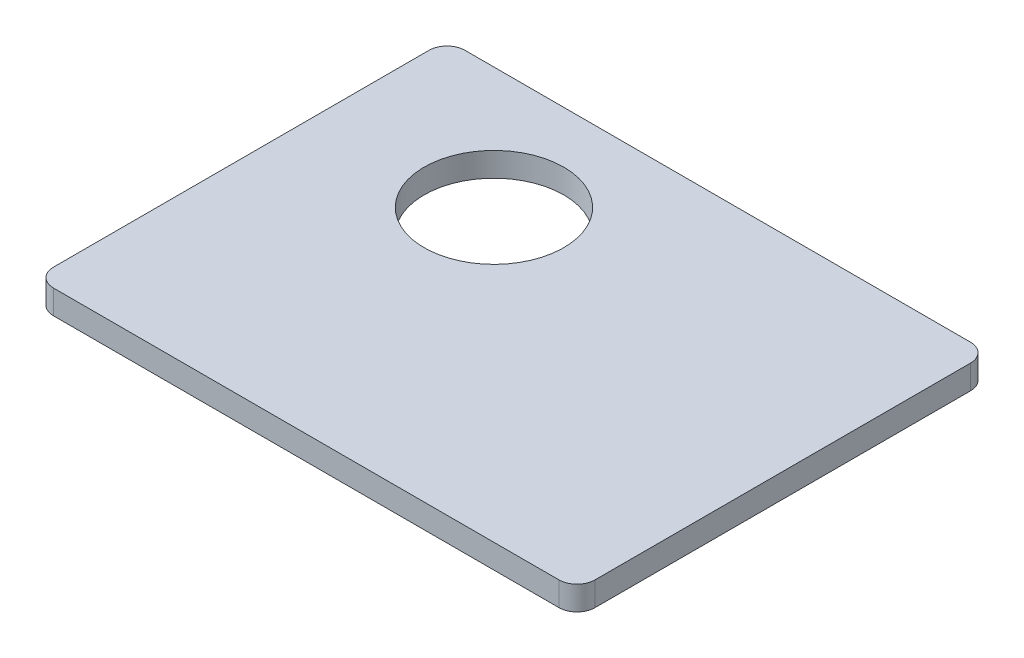
ISO-10303-21;
HEADER;
FILE_DESCRIPTION(('STEP AP214'),'2;1');
FILE_NAME('part.step','',(''),(''),'','','');
FILE_SCHEMA(('AUTOMOTIVE_DESIGN { 1 0 10303 214 1 1 1 1 }'));
ENDSEC;
DATA;
#1=APPLICATION_CONTEXT('core data for automotive mechanical design processes');
#2=APPLICATION_PROTOCOL_DEFINITION('international standard','automotive_design',2000,#1);
#3=PRODUCT_CONTEXT('',#1,'mechanical');
#4=PRODUCT('Part','Part','',(#3));
#5=PRODUCT_RELATED_PRODUCT_CATEGORY('part','',(#4));
#6=PRODUCT_DEFINITION_FORMATION('','',#4);
#7=PRODUCT_DEFINITION_CONTEXT('part definition',#1,'design');
#8=PRODUCT_DEFINITION('design','',#6,#7);
#9=PRODUCT_DEFINITION_SHAPE('','',#8);
#10=(LENGTH_UNIT() NAMED_UNIT(*) SI_UNIT(.MILLI.,.METRE.));
#11=(NAMED_UNIT(*) PLANE_ANGLE_UNIT() SI_UNIT($,.RADIAN.));
#12=(NAMED_UNIT(*) SI_UNIT($,.STERADIAN.) SOLID_ANGLE_UNIT());
#13=UNCERTAINTY_MEASURE_WITH_UNIT(LENGTH_MEASURE(1.E-05),#10,'distance_accuracy_value','');
#14=(GEOMETRIC_REPRESENTATION_CONTEXT(3) GLOBAL_UNCERTAINTY_ASSIGNED_CONTEXT((#13)) GLOBAL_UNIT_ASSIGNED_CONTEXT((#10,
#11,#12)) REPRESENTATION_CONTEXT('',''));
#15=CARTESIAN_POINT('',(0.,0.,0.));
#16=DIRECTION('',(0.,0.,1.));
#17=DIRECTION('',(1.,0.,0.));
#18=AXIS2_PLACEMENT_3D('',#15,#16,#17);
#19=CARTESIAN_POINT('',(0.,1.,7.15787898398317));
#20=DIRECTION('',(0.,0.,-1.));
#21=DIRECTION('',(-1.,0.,0.));
#22=AXIS2_PLACEMENT_3D('',#19,#20,#21);
#23=PLANE('',#22);
#24=DIRECTION('',(1.,0.,0.));
#25=VECTOR('',#24,1.);
#26=CARTESIAN_POINT('',(0.,0.,7.15787898398317));
#27=LINE('',#26,#25);
#28=CARTESIAN_POINT('',(-10.7596343633716,0.,7.15787898398317));
#29=VERTEX_POINT('',#28);
#30=CARTESIAN_POINT('',(10.2403656366284,0.,7.15787898398317));
#31=VERTEX_POINT('',#30);
#32=EDGE_CURVE('E131',#29,#31,#27,.T.);
#33=ORIENTED_EDGE('',*,*,#32,.F.);
#34=DIRECTION('',(0.,-1.,0.));
#35=VECTOR('',#34,1.);
#36=CARTESIAN_POINT('',(-10.7596343633716,1.,7.15787898398317));
#37=LINE('',#36,#35);
#38=CARTESIAN_POINT('',(-10.7596343633716,1.,7.15787898398317));
#39=VERTEX_POINT('',#38);
#40=EDGE_CURVE('E11',#39,#29,#37,.T.);
#41=ORIENTED_EDGE('',*,*,#40,.F.);
#42=DIRECTION('',(1.,0.,0.));
#43=VECTOR('',#42,1.);
#44=CARTESIAN_POINT('',(0.,1.,7.15787898398317));
#45=LINE('',#44,#43);
#46=CARTESIAN_POINT('',(10.2403656366284,1.,7.15787898398317));
#47=VERTEX_POINT('',#46);
#48=EDGE_CURVE('E148',#39,#47,#45,.T.);
#49=ORIENTED_EDGE('',*,*,#48,.T.);
#50=DIRECTION('',(0.,-1.,0.));
#51=VECTOR('',#50,1.);
#52=CARTESIAN_POINT('',(10.2403656366284,1.,7.15787898398317));
#53=LINE('',#52,#51);
#54=EDGE_CURVE('E53',#47,#31,#53,.T.);
#55=ORIENTED_EDGE('',*,*,#54,.T.);
#56=EDGE_LOOP('',(#33,#41,#49,#55));
#57=FACE_BOUND('',#56,.T.);
#58=ADVANCED_FACE('F37',(#57),#23,.T.);
#59=CARTESIAN_POINT('',(-10.7596343633716,1.,7.90787898398317));
#60=DIRECTION('',(0.,-1.,0.));
#61=DIRECTION('',(0.,0.,-1.));
#62=AXIS2_PLACEMENT_3D('',#59,#60,#61);
#63=CYLINDRICAL_SURFACE('',#62,0.750000000000001);
#64=CARTESIAN_POINT('',(-10.7596343633716,0.,7.90787898398317));
#65=DIRECTION('',(0.,1.,0.));
#66=DIRECTION('',(0.,0.,1.));
#67=AXIS2_PLACEMENT_3D('',#64,#65,#66);
#68=CIRCLE('',#67,0.750000000000001);
#69=CARTESIAN_POINT('',(-11.5096343633716,0.,7.90787898398318));
#70=VERTEX_POINT('',#69);
#71=EDGE_CURVE('E133',#29,#70,#68,.T.);
#72=ORIENTED_EDGE('',*,*,#71,.T.);
#73=DIRECTION('',(0.,-1.,0.));
#74=VECTOR('',#73,1.);
#75=CARTESIAN_POINT('',(-11.5096343633716,1.,7.90787898398318));
#76=LINE('',#75,#74);
#77=CARTESIAN_POINT('',(-11.5096343633716,1.,7.90787898398318));
#78=VERTEX_POINT('',#77);
#79=EDGE_CURVE('E45',#78,#70,#76,.T.);
#80=ORIENTED_EDGE('',*,*,#79,.F.);
#81=CARTESIAN_POINT('',(-10.7596343633716,1.,7.90787898398317));
#82=DIRECTION('',(0.,1.,0.));
#83=DIRECTION('',(0.,0.,1.));
#84=AXIS2_PLACEMENT_3D('',#81,#82,#83);
#85=CIRCLE('',#84,0.750000000000001);
#86=EDGE_CURVE('E181',#39,#78,#85,.T.);
#87=ORIENTED_EDGE('',*,*,#86,.F.);
#88=ORIENTED_EDGE('',*,*,#40,.T.);
#89=EDGE_LOOP('',(#72,#80,#87,#88));
#90=FACE_BOUND('',#89,.T.);
#91=ADVANCED_FACE('F207',(#90),#63,.T.);
#92=CARTESIAN_POINT('',(-11.5096343633716,1.,0.));
#93=DIRECTION('',(1.,0.,0.));
#94=DIRECTION('',(0.,0.,-1.));
#95=AXIS2_PLACEMENT_3D('',#92,#93,#94);
#96=PLANE('',#95);
#97=DIRECTION('',(0.,0.,1.));
#98=VECTOR('',#97,1.);
#99=CARTESIAN_POINT('',(-11.5096343633716,0.,0.));
#100=LINE('',#99,#98);
#101=CARTESIAN_POINT('',(-11.5096343633716,0.,23.5078789839832));
#102=VERTEX_POINT('',#101);
#103=EDGE_CURVE('E136',#70,#102,#100,.T.);
#104=ORIENTED_EDGE('',*,*,#103,.T.);
#105=DIRECTION('',(0.,-1.,0.));
#106=VECTOR('',#105,1.);
#107=CARTESIAN_POINT('',(-11.5096343633716,1.,23.5078789839832));
#108=LINE('',#107,#106);
#109=CARTESIAN_POINT('',(-11.5096343633716,1.,23.5078789839832));
#110=VERTEX_POINT('',#109);
#111=EDGE_CURVE('E155',#110,#102,#108,.T.);
#112=ORIENTED_EDGE('',*,*,#111,.F.);
#113=DIRECTION('',(0.,0.,1.));
#114=VECTOR('',#113,1.);
#115=CARTESIAN_POINT('',(-11.5096343633716,1.,0.));
#116=LINE('',#115,#114);
#117=EDGE_CURVE('E164',#78,#110,#116,.T.);
#118=ORIENTED_EDGE('',*,*,#117,.F.);
#119=ORIENTED_EDGE('',*,*,#79,.T.);
#120=EDGE_LOOP('',(#104,#112,#118,#119));
#121=FACE_BOUND('',#120,.T.);
#122=ADVANCED_FACE('F162',(#121),#96,.F.);
#123=CARTESIAN_POINT('',(-10.7596343633716,1.,23.5078789839832));
#124=DIRECTION('',(0.,-1.,0.));
#125=DIRECTION('',(0.,0.,-1.));
#126=AXIS2_PLACEMENT_3D('',#123,#124,#125);
#127=CYLINDRICAL_SURFACE('',#126,0.750000000000001);
#128=CARTESIAN_POINT('',(-10.7596343633716,0.,23.5078789839832));
#129=DIRECTION('',(0.,1.,0.));
#130=DIRECTION('',(0.,0.,1.));
#131=AXIS2_PLACEMENT_3D('',#128,#129,#130);
#132=CIRCLE('',#131,0.750000000000001);
#133=CARTESIAN_POINT('',(-10.7596343633716,0.,24.2578789839832));
#134=VERTEX_POINT('',#133);
#135=EDGE_CURVE('E138',#102,#134,#132,.T.);
#136=ORIENTED_EDGE('',*,*,#135,.T.);
#137=DIRECTION('',(0.,-1.,0.));
#138=VECTOR('',#137,1.);
#139=CARTESIAN_POINT('',(-10.7596343633716,1.,24.2578789839832));
#140=LINE('',#139,#138);
#141=CARTESIAN_POINT('',(-10.7596343633716,1.,24.2578789839832));
#142=VERTEX_POINT('',#141);
#143=EDGE_CURVE('E152',#142,#134,#140,.T.);
#144=ORIENTED_EDGE('',*,*,#143,.F.);
#145=CARTESIAN_POINT('',(-10.7596343633716,1.,23.5078789839832));
#146=DIRECTION('',(0.,1.,0.));
#147=DIRECTION('',(0.,0.,1.));
#148=AXIS2_PLACEMENT_3D('',#145,#146,#147);
#149=CIRCLE('',#148,0.750000000000001);
#150=EDGE_CURVE('E177',#110,#142,#149,.T.);
#151=ORIENTED_EDGE('',*,*,#150,.F.);
#152=ORIENTED_EDGE('',*,*,#111,.T.);
#153=EDGE_LOOP('',(#136,#144,#151,#152));
#154=FACE_BOUND('',#153,.T.);
#155=ADVANCED_FACE('F173',(#154),#127,.T.);
#156=CARTESIAN_POINT('',(0.,1.,24.2578789839832));
#157=DIRECTION('',(0.,0.,-1.));
#158=DIRECTION('',(-1.,0.,0.));
#159=AXIS2_PLACEMENT_3D('',#156,#157,#158);
#160=PLANE('',#159);
#161=DIRECTION('',(1.,0.,0.));
#162=VECTOR('',#161,1.);
#163=CARTESIAN_POINT('',(0.,0.,24.2578789839832));
#164=LINE('',#163,#162);
#165=CARTESIAN_POINT('',(10.2403656366284,0.,24.2578789839832));
#166=VERTEX_POINT('',#165);
#167=EDGE_CURVE('E140',#134,#166,#164,.T.);
#168=ORIENTED_EDGE('',*,*,#167,.T.);
#169=DIRECTION('',(0.,-1.,0.));
#170=VECTOR('',#169,1.);
#171=CARTESIAN_POINT('',(10.2403656366284,1.,24.2578789839832));
#172=LINE('',#171,#170);
#173=CARTESIAN_POINT('',(10.2403656366284,1.,24.2578789839832));
#174=VERTEX_POINT('',#173);
#175=EDGE_CURVE('E123',#174,#166,#172,.T.);
#176=ORIENTED_EDGE('',*,*,#175,.F.);
#177=DIRECTION('',(1.,0.,0.));
#178=VECTOR('',#177,1.);
#179=CARTESIAN_POINT('',(0.,1.,24.2578789839832));
#180=LINE('',#179,#178);
#181=EDGE_CURVE('E111',#142,#174,#180,.T.);
#182=ORIENTED_EDGE('',*,*,#181,.F.);
#183=ORIENTED_EDGE('',*,*,#143,.T.);
#184=EDGE_LOOP('',(#168,#176,#182,#183));
#185=FACE_BOUND('',#184,.T.);
#186=ADVANCED_FACE('F176',(#185),#160,.F.);
#187=CARTESIAN_POINT('',(10.2403656366284,1.,23.5078789839832));
#188=DIRECTION('',(0.,-1.,0.));
#189=DIRECTION('',(0.,0.,-1.));
#190=AXIS2_PLACEMENT_3D('',#187,#188,#189);
#191=CYLINDRICAL_SURFACE('',#190,0.750000000000001);
#192=CARTESIAN_POINT('',(10.2403656366284,0.,23.5078789839832));
#193=DIRECTION('',(0.,1.,0.));
#194=DIRECTION('',(0.,0.,1.));
#195=AXIS2_PLACEMENT_3D('',#192,#193,#194);
#196=CIRCLE('',#195,0.750000000000001);
#197=CARTESIAN_POINT('',(10.9903656366284,0.,23.5078789839832));
#198=VERTEX_POINT('',#197);
#199=EDGE_CURVE('E120',#166,#198,#196,.T.);
#200=ORIENTED_EDGE('',*,*,#199,.T.);
#201=DIRECTION('',(0.,-1.,0.));
#202=VECTOR('',#201,1.);
#203=CARTESIAN_POINT('',(10.9903656366284,1.,23.5078789839832));
#204=LINE('',#203,#202);
#205=CARTESIAN_POINT('',(10.9903656366284,1.,23.5078789839832));
#206=VERTEX_POINT('',#205);
#207=EDGE_CURVE('E117',#206,#198,#204,.T.);
#208=ORIENTED_EDGE('',*,*,#207,.F.);
#209=CARTESIAN_POINT('',(10.2403656366284,1.,23.5078789839832));
#210=DIRECTION('',(0.,1.,0.));
#211=DIRECTION('',(0.,0.,1.));
#212=AXIS2_PLACEMENT_3D('',#209,#210,#211);
#213=CIRCLE('',#212,0.750000000000001);
#214=EDGE_CURVE('E103',#174,#206,#213,.T.);
#215=ORIENTED_EDGE('',*,*,#214,.F.);
#216=ORIENTED_EDGE('',*,*,#175,.T.);
#217=EDGE_LOOP('',(#200,#208,#215,#216));
#218=FACE_BOUND('',#217,.T.);
#219=ADVANCED_FACE('F118',(#218),#191,.T.);
#220=CARTESIAN_POINT('',(10.9903656366284,1.,0.));
#221=DIRECTION('',(1.,0.,0.));
#222=DIRECTION('',(0.,0.,-1.));
#223=AXIS2_PLACEMENT_3D('',#220,#221,#222);
#224=PLANE('',#223);
#225=DIRECTION('',(0.,0.,1.));
#226=VECTOR('',#225,1.);
#227=CARTESIAN_POINT('',(10.9903656366284,0.,0.));
#228=LINE('',#227,#226);
#229=CARTESIAN_POINT('',(10.9903656366284,0.,7.90787898398317));
#230=VERTEX_POINT('',#229);
#231=EDGE_CURVE('E143',#230,#198,#228,.T.);
#232=ORIENTED_EDGE('',*,*,#231,.F.);
#233=DIRECTION('',(0.,-1.,0.));
#234=VECTOR('',#233,1.);
#235=CARTESIAN_POINT('',(10.9903656366284,1.,7.90787898398317));
#236=LINE('',#235,#234);
#237=CARTESIAN_POINT('',(10.9903656366284,1.,7.90787898398317));
#238=VERTEX_POINT('',#237);
#239=EDGE_CURVE('E78',#238,#230,#236,.T.);
#240=ORIENTED_EDGE('',*,*,#239,.F.);
#241=DIRECTION('',(0.,0.,1.));
#242=VECTOR('',#241,1.);
#243=CARTESIAN_POINT('',(10.9903656366284,1.,0.));
#244=LINE('',#243,#242);
#245=EDGE_CURVE('E109',#238,#206,#244,.T.);
#246=ORIENTED_EDGE('',*,*,#245,.T.);
#247=ORIENTED_EDGE('',*,*,#207,.T.);
#248=EDGE_LOOP('',(#232,#240,#246,#247));
#249=FACE_BOUND('',#248,.T.);
#250=ADVANCED_FACE('F125',(#249),#224,.T.);
#251=CARTESIAN_POINT('',(10.2403656366284,1.,7.90787898398317));
#252=DIRECTION('',(0.,-1.,0.));
#253=DIRECTION('',(0.,0.,-1.));
#254=AXIS2_PLACEMENT_3D('',#251,#252,#253);
#255=CYLINDRICAL_SURFACE('',#254,0.750000000000001);
#256=CARTESIAN_POINT('',(10.2403656366284,0.,7.90787898398317));
#257=DIRECTION('',(0.,1.,0.));
#258=DIRECTION('',(0.,0.,1.));
#259=AXIS2_PLACEMENT_3D('',#256,#257,#258);
#260=CIRCLE('',#259,0.750000000000001);
#261=EDGE_CURVE('E145',#31,#230,#260,.F.);
#262=ORIENTED_EDGE('',*,*,#261,.F.);
#263=ORIENTED_EDGE('',*,*,#54,.F.);
#264=CARTESIAN_POINT('',(10.2403656366284,1.,7.90787898398317));
#265=DIRECTION('',(0.,1.,0.));
#266=DIRECTION('',(0.,0.,1.));
#267=AXIS2_PLACEMENT_3D('',#264,#265,#266);
#268=CIRCLE('',#267,0.750000000000001);
#269=EDGE_CURVE('E126',#47,#238,#268,.F.);
#270=ORIENTED_EDGE('',*,*,#269,.T.);
#271=ORIENTED_EDGE('',*,*,#239,.T.);
#272=EDGE_LOOP('',(#262,#263,#270,#271));
#273=FACE_BOUND('',#272,.T.);
#274=ADVANCED_FACE('F198',(#273),#255,.T.);
#275=CARTESIAN_POINT('',(0.,1.,0.));
#276=DIRECTION('',(0.,1.,0.));
#277=DIRECTION('',(0.,0.,1.));
#278=AXIS2_PLACEMENT_3D('',#275,#276,#277);
#279=PLANE('',#278);
#280=CARTESIAN_POINT('',(-4.50963436337162,1.,12.2078789839832));
#281=DIRECTION('',(0.,1.,0.));
#282=DIRECTION('',(0.,0.,-1.));
#283=AXIS2_PLACEMENT_3D('',#280,#281,#282);
#284=CIRCLE('',#283,2.9);
#285=CARTESIAN_POINT('',(-4.50963436337162,1.,9.30787898398317));
#286=VERTEX_POINT('',#285);
#287=EDGE_CURVE('E184',#286,#286,#284,.T.);
#288=ORIENTED_EDGE('',*,*,#287,.F.);
#289=EDGE_LOOP('',(#288));
#290=FACE_BOUND('',#289,.T.);
#291=ORIENTED_EDGE('',*,*,#48,.F.);
#292=ORIENTED_EDGE('',*,*,#86,.T.);
#293=ORIENTED_EDGE('',*,*,#117,.T.);
#294=ORIENTED_EDGE('',*,*,#150,.T.);
#295=ORIENTED_EDGE('',*,*,#181,.T.);
#296=ORIENTED_EDGE('',*,*,#214,.T.);
#297=ORIENTED_EDGE('',*,*,#245,.F.);
#298=ORIENTED_EDGE('',*,*,#269,.F.);
#299=EDGE_LOOP('',(#291,#292,#293,#294,#295,#296,#297,#298));
#300=FACE_BOUND('',#299,.T.);
#301=ADVANCED_FACE('F106',(#290,#300),#279,.T.);
#302=CARTESIAN_POINT('',(0.,0.,0.));
#303=DIRECTION('',(0.,1.,0.));
#304=DIRECTION('',(0.,0.,1.));
#305=AXIS2_PLACEMENT_3D('',#302,#303,#304);
#306=PLANE('',#305);
#307=CARTESIAN_POINT('',(-4.50963436337162,0.,12.2078789839832));
#308=DIRECTION('',(0.,1.,0.));
#309=DIRECTION('',(0.,0.,-1.));
#310=AXIS2_PLACEMENT_3D('',#307,#308,#309);
#311=CIRCLE('',#310,2.9);
#312=CARTESIAN_POINT('',(-4.50963436337162,0.,9.30787898398317));
#313=VERTEX_POINT('',#312);
#314=EDGE_CURVE('E134',#313,#313,#311,.T.);
#315=ORIENTED_EDGE('',*,*,#314,.T.);
#316=EDGE_LOOP('',(#315));
#317=FACE_BOUND('',#316,.T.);
#318=ORIENTED_EDGE('',*,*,#32,.T.);
#319=ORIENTED_EDGE('',*,*,#261,.T.);
#320=ORIENTED_EDGE('',*,*,#231,.T.);
#321=ORIENTED_EDGE('',*,*,#199,.F.);
#322=ORIENTED_EDGE('',*,*,#167,.F.);
#323=ORIENTED_EDGE('',*,*,#135,.F.);
#324=ORIENTED_EDGE('',*,*,#103,.F.);
#325=ORIENTED_EDGE('',*,*,#71,.F.);
#326=EDGE_LOOP('',(#318,#319,#320,#321,#322,#323,#324,#325));
#327=FACE_BOUND('',#326,.T.);
#328=ADVANCED_FACE('F169',(#317,#327),#306,.F.);
#329=CARTESIAN_POINT('',(-4.50963436337162,0.,12.2078789839832));
#330=DIRECTION('',(0.,1.,0.));
#331=DIRECTION('',(0.,0.,1.));
#332=AXIS2_PLACEMENT_3D('',#329,#330,#331);
#333=CYLINDRICAL_SURFACE('',#332,2.9);
#334=ORIENTED_EDGE('',*,*,#314,.F.);
#335=EDGE_LOOP('',(#334));
#336=FACE_BOUND('',#335,.T.);
#337=ORIENTED_EDGE('',*,*,#287,.T.);
#338=EDGE_LOOP('',(#337));
#339=FACE_BOUND('',#338,.T.);
#340=ADVANCED_FACE('F191',(#336,#339),#333,.F.);
#341=CLOSED_SHELL('',(#58,#91,#122,#155,#186,#219,#250,#274,#301,#328,#340));
#342=MANIFOLD_SOLID_BREP('B2',#341);
#343=ADVANCED_BREP_SHAPE_REPRESENTATION('',(#18,#342),#14);
#344=SHAPE_DEFINITION_REPRESENTATION(#9,#343);
ENDSEC;
END-ISO-10303-21;
